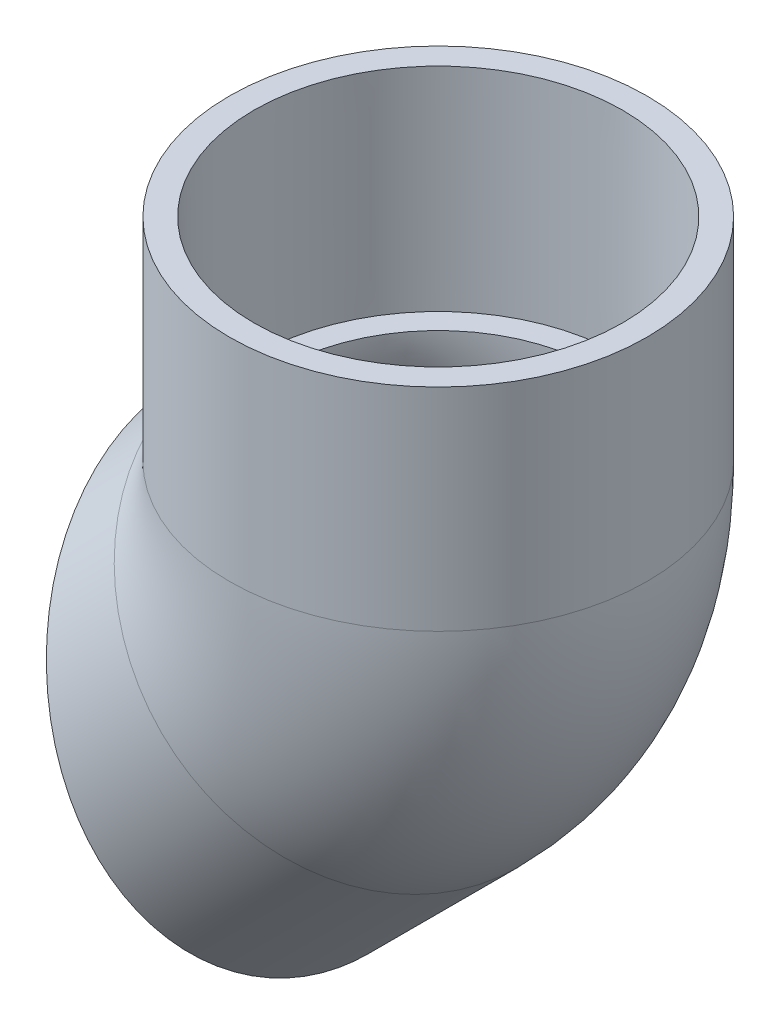
ISO-10303-21;
HEADER;
FILE_DESCRIPTION(('STEP AP214'),'2;1');
FILE_NAME('part.step','',(''),(''),'','','');
FILE_SCHEMA(('AUTOMOTIVE_DESIGN { 1 0 10303 214 1 1 1 1 }'));
ENDSEC;
DATA;
#1=APPLICATION_CONTEXT('core data for automotive mechanical design processes');
#2=APPLICATION_PROTOCOL_DEFINITION('international standard','automotive_design',2000,#1);
#3=PRODUCT_CONTEXT('',#1,'mechanical');
#4=PRODUCT('Part','Part','',(#3));
#5=PRODUCT_RELATED_PRODUCT_CATEGORY('part','',(#4));
#6=PRODUCT_DEFINITION_FORMATION('','',#4);
#7=PRODUCT_DEFINITION_CONTEXT('part definition',#1,'design');
#8=PRODUCT_DEFINITION('design','',#6,#7);
#9=PRODUCT_DEFINITION_SHAPE('','',#8);
#10=(LENGTH_UNIT() NAMED_UNIT(*) SI_UNIT(.MILLI.,.METRE.));
#11=(NAMED_UNIT(*) PLANE_ANGLE_UNIT() SI_UNIT($,.RADIAN.));
#12=(NAMED_UNIT(*) SI_UNIT($,.STERADIAN.) SOLID_ANGLE_UNIT());
#13=UNCERTAINTY_MEASURE_WITH_UNIT(LENGTH_MEASURE(1.E-05),#10,'distance_accuracy_value','');
#14=(GEOMETRIC_REPRESENTATION_CONTEXT(3) GLOBAL_UNCERTAINTY_ASSIGNED_CONTEXT((#13)) GLOBAL_UNIT_ASSIGNED_CONTEXT((#10,
#11,#12)) REPRESENTATION_CONTEXT('',''));
#15=CARTESIAN_POINT('',(0.,0.,0.));
#16=DIRECTION('',(0.,0.,1.));
#17=DIRECTION('',(1.,0.,0.));
#18=AXIS2_PLACEMENT_3D('',#15,#16,#17);
#19=CARTESIAN_POINT('',(-35.831221923066,-35.8312219230659,0.));
#20=DIRECTION('',(-0.707106781186549,-0.707106781186546,0.));
#21=DIRECTION('',(0.707106781186546,-0.707106781186549,0.));
#22=AXIS2_PLACEMENT_3D('',#19,#20,#21);
#23=CYLINDRICAL_SURFACE('',#22,34.3535);
#24=CARTESIAN_POINT('',(-26.8509658019968,-26.8509658019967,0.));
#25=DIRECTION('',(0.908425279154339,0.418047260717447,0.));
#26=DIRECTION('',(0.418047260717447,-0.908425279154339,0.));
#27=AXIS2_PLACEMENT_3D('',#24,#25,#26);
#28=ELLIPSE('',#27,36.6258510105909,34.3535);
#29=CARTESIAN_POINT('',(-11.539629115574,-60.122814730558,0.));
#30=VERTEX_POINT('',#29);
#31=EDGE_CURVE('E12',#30,#30,#28,.F.);
#32=ORIENTED_EDGE('',*,*,#31,.F.);
#33=EDGE_LOOP('',(#32));
#34=FACE_BOUND('',#33,.T.);
#35=CARTESIAN_POINT('',(-11.2253201513365,-11.2253201513364,0.));
#36=DIRECTION('',(-0.707106781186549,-0.707106781186546,0.));
#37=DIRECTION('',(0.707106781186546,-0.707106781186549,0.));
#38=AXIS2_PLACEMENT_3D('',#35,#36,#37);
#39=CIRCLE('',#38,34.3535);
#40=CARTESIAN_POINT('',(13.0662726561555,-35.5169129588286,0.));
#41=VERTEX_POINT('',#40);
#42=EDGE_CURVE('E59',#41,#41,#39,.T.);
#43=ORIENTED_EDGE('',*,*,#42,.T.);
#44=EDGE_LOOP('',(#43));
#45=FACE_BOUND('',#44,.T.);
#46=ADVANCED_FACE('F44',(#34,#45),#23,.T.);
#47=CARTESIAN_POINT('',(-11.2253201513365,-11.2253201513364,0.));
#48=DIRECTION('',(-0.707106781186549,-0.707106781186546,0.));
#49=DIRECTION('',(0.707106781186546,-0.707106781186549,0.));
#50=AXIS2_PLACEMENT_3D('',#47,#48,#49);
#51=CONICAL_SURFACE('',#50,30.0863,0.00656924856536322);
#52=CARTESIAN_POINT('',(-26.8182423880505,-26.9220744522437,0.));
#53=DIRECTION('',(0.908425279154339,0.418047260717447,0.));
#54=DIRECTION('',(0.418047260717447,-0.908425279154339,0.));
#55=AXIS2_PLACEMENT_3D('',#52,#53,#54);
#56=ELLIPSE('',#55,32.231354088452,30.2315584970028);
#57=CARTESIAN_POINT('',(-13.344013102159,-56.2018512875681,0.));
#58=VERTEX_POINT('',#57);
#59=EDGE_CURVE('E79',#58,#58,#56,.T.);
#60=ORIENTED_EDGE('',*,*,#59,.F.);
#61=EDGE_LOOP('',(#60));
#62=FACE_BOUND('',#61,.T.);
#63=CARTESIAN_POINT('',(-11.2253201513365,-11.2253201513364,0.));
#64=DIRECTION('',(-0.707106781186549,-0.707106781186546,0.));
#65=DIRECTION('',(0.707106781186546,-0.707106781186549,0.));
#66=AXIS2_PLACEMENT_3D('',#63,#64,#65);
#67=CIRCLE('',#66,30.0863);
#68=CARTESIAN_POINT('',(10.0489065994763,-32.4995469021493,0.));
#69=VERTEX_POINT('',#68);
#70=EDGE_CURVE('E55',#69,#69,#67,.T.);
#71=ORIENTED_EDGE('',*,*,#70,.F.);
#72=EDGE_LOOP('',(#71));
#73=FACE_BOUND('',#72,.T.);
#74=ADVANCED_FACE('F46',(#62,#73),#51,.F.);
#75=CARTESIAN_POINT('',(-38.3256403026728,15.875,0.));
#76=DIRECTION('',(0.,0.,-1.));
#77=DIRECTION('',(-1.,0.,0.));
#78=AXIS2_PLACEMENT_3D('',#75,#76,#77);
#79=TOROIDAL_SURFACE('',#78,38.3256403026728,26.2509);
#80=CARTESIAN_POINT('',(0.,15.875,0.));
#81=DIRECTION('',(0.,1.,0.));
#82=DIRECTION('',(-1.,0.,0.));
#83=AXIS2_PLACEMENT_3D('',#80,#81,#82);
#84=CIRCLE('',#83,26.2509);
#85=CARTESIAN_POINT('',(26.2509,15.875,0.));
#86=VERTEX_POINT('',#85);
#87=EDGE_CURVE('E67',#86,#86,#84,.T.);
#88=CARTESIAN_POINT('',(-11.2253201513365,-11.2253201513364,0.));
#89=DIRECTION('',(0.707106781186549,0.707106781186546,0.));
#90=DIRECTION('',(-0.707106781186546,0.707106781186549,0.));
#91=AXIS2_PLACEMENT_3D('',#88,#89,#90);
#92=CIRCLE('',#91,26.2509);
#93=CARTESIAN_POINT('',(7.33686925091343,-29.7875095535864,0.));
#94=VERTEX_POINT('',#93);
#95=EDGE_CURVE('E70',#94,#94,#92,.T.);
#96=CARTESIAN_POINT('',(-38.3256403026728,15.875,0.));
#97=DIRECTION('',(0.,0.,-1.));
#98=DIRECTION('',(-1.,0.,0.));
#99=AXIS2_PLACEMENT_3D('',#96,#97,#98);
#100=CIRCLE('',#99,64.5765403026728);
#101=EDGE_CURVE('',#86,#94,#100,.T.);
#102=ORIENTED_EDGE('',*,*,#87,.T.);
#103=ORIENTED_EDGE('',*,*,#95,.F.);
#104=ORIENTED_EDGE('',*,*,#101,.T.);
#105=ORIENTED_EDGE('',*,*,#101,.F.);
#106=EDGE_LOOP('',(#102,#104,#103,#105));
#107=FACE_BOUND('',#106,.T.);
#108=ADVANCED_FACE('F87',(#107),#79,.F.);
#109=CARTESIAN_POINT('',(-38.3256403026728,15.875,0.));
#110=DIRECTION('',(0.,0.,-1.));
#111=DIRECTION('',(-1.,0.,0.));
#112=AXIS2_PLACEMENT_3D('',#109,#110,#111);
#113=TOROIDAL_SURFACE('',#112,38.3256403026728,34.3535);
#114=CARTESIAN_POINT('',(0.,15.875,0.));
#115=DIRECTION('',(0.,1.,0.));
#116=DIRECTION('',(-1.,0.,0.));
#117=AXIS2_PLACEMENT_3D('',#114,#115,#116);
#118=CIRCLE('',#117,34.3535);
#119=CARTESIAN_POINT('',(34.3535,15.875,0.));
#120=VERTEX_POINT('',#119);
#121=EDGE_CURVE('E64',#120,#120,#118,.T.);
#122=CARTESIAN_POINT('',(-38.3256403026728,15.875,0.));
#123=DIRECTION('',(0.,0.,-1.));
#124=DIRECTION('',(-1.,0.,0.));
#125=AXIS2_PLACEMENT_3D('',#122,#123,#124);
#126=CIRCLE('',#125,72.6791403026728);
#127=EDGE_CURVE('',#120,#41,#126,.T.);
#128=ORIENTED_EDGE('',*,*,#121,.F.);
#129=ORIENTED_EDGE('',*,*,#42,.F.);
#130=ORIENTED_EDGE('',*,*,#127,.T.);
#131=ORIENTED_EDGE('',*,*,#127,.F.);
#132=EDGE_LOOP('',(#128,#130,#129,#131));
#133=FACE_BOUND('',#132,.T.);
#134=ADVANCED_FACE('F96',(#133),#113,.T.);
#135=CARTESIAN_POINT('',(0.,15.875,0.));
#136=DIRECTION('',(0.,1.,0.));
#137=DIRECTION('',(-1.,0.,0.));
#138=AXIS2_PLACEMENT_3D('',#135,#136,#137);
#139=PLANE('',#138);
#140=CARTESIAN_POINT('',(0.,15.875,0.));
#141=DIRECTION('',(0.,1.,0.));
#142=DIRECTION('',(-1.,0.,0.));
#143=AXIS2_PLACEMENT_3D('',#140,#141,#142);
#144=CIRCLE('',#143,30.0863);
#145=CARTESIAN_POINT('',(-30.0863,15.875,0.));
#146=VERTEX_POINT('',#145);
#147=EDGE_CURVE('E51',#146,#146,#144,.F.);
#148=ORIENTED_EDGE('',*,*,#147,.F.);
#149=EDGE_LOOP('',(#148));
#150=FACE_BOUND('',#149,.T.);
#151=ORIENTED_EDGE('',*,*,#87,.F.);
#152=EDGE_LOOP('',(#151));
#153=FACE_BOUND('',#152,.T.);
#154=ADVANCED_FACE('F94',(#150,#153),#139,.T.);
#155=CARTESIAN_POINT('',(-11.2253201513365,-11.2253201513364,0.));
#156=DIRECTION('',(0.707106781186549,0.707106781186546,0.));
#157=DIRECTION('',(-0.707106781186546,0.707106781186549,0.));
#158=AXIS2_PLACEMENT_3D('',#155,#156,#157);
#159=PLANE('',#158);
#160=ORIENTED_EDGE('',*,*,#70,.T.);
#161=EDGE_LOOP('',(#160));
#162=FACE_BOUND('',#161,.T.);
#163=ORIENTED_EDGE('',*,*,#95,.T.);
#164=EDGE_LOOP('',(#163));
#165=FACE_BOUND('',#164,.T.);
#166=ADVANCED_FACE('F90',(#162,#165),#159,.F.);
#167=CARTESIAN_POINT('',(34.3535,50.673,0.));
#168=DIRECTION('',(0.,1.,0.));
#169=DIRECTION('',(0.,0.,1.));
#170=AXIS2_PLACEMENT_3D('',#167,#168,#169);
#171=PLANE('',#170);
#172=CARTESIAN_POINT('',(0.,50.673,0.));
#173=DIRECTION('',(0.,-1.,0.));
#174=DIRECTION('',(0.,0.,-1.));
#175=AXIS2_PLACEMENT_3D('',#172,#173,#174);
#176=CIRCLE('',#175,30.3149);
#177=CARTESIAN_POINT('',(0.,50.673,-30.3149));
#178=VERTEX_POINT('',#177);
#179=EDGE_CURVE('E76',#178,#178,#176,.T.);
#180=ORIENTED_EDGE('',*,*,#179,.T.);
#181=EDGE_LOOP('',(#180));
#182=FACE_BOUND('',#181,.T.);
#183=CARTESIAN_POINT('',(0.,50.673,0.));
#184=DIRECTION('',(0.,-1.,0.));
#185=DIRECTION('',(0.,0.,-1.));
#186=AXIS2_PLACEMENT_3D('',#183,#184,#185);
#187=CIRCLE('',#186,34.3535);
#188=CARTESIAN_POINT('',(0.,50.673,-34.3535));
#189=VERTEX_POINT('',#188);
#190=EDGE_CURVE('E73',#189,#189,#187,.T.);
#191=ORIENTED_EDGE('',*,*,#190,.F.);
#192=EDGE_LOOP('',(#191));
#193=FACE_BOUND('',#192,.T.);
#194=ADVANCED_FACE('F93',(#182,#193),#171,.T.);
#195=CARTESIAN_POINT('',(0.,0.,0.));
#196=DIRECTION('',(0.,-1.,0.));
#197=DIRECTION('',(0.,0.,-1.));
#198=AXIS2_PLACEMENT_3D('',#195,#196,#197);
#199=CYLINDRICAL_SURFACE('',#198,34.3535);
#200=ORIENTED_EDGE('',*,*,#190,.T.);
#201=EDGE_LOOP('',(#200));
#202=FACE_BOUND('',#201,.T.);
#203=ORIENTED_EDGE('',*,*,#121,.T.);
#204=EDGE_LOOP('',(#203));
#205=FACE_BOUND('',#204,.T.);
#206=ADVANCED_FACE('F153',(#202,#205),#199,.T.);
#207=CARTESIAN_POINT('',(0.,50.673,0.));
#208=DIRECTION('',(0.,1.,0.));
#209=DIRECTION('',(0.,0.,1.));
#210=AXIS2_PLACEMENT_3D('',#207,#208,#209);
#211=CONICAL_SURFACE('',#210,30.3149,0.00656924856536293);
#212=ORIENTED_EDGE('',*,*,#147,.T.);
#213=EDGE_LOOP('',(#212));
#214=FACE_BOUND('',#213,.T.);
#215=ORIENTED_EDGE('',*,*,#179,.F.);
#216=EDGE_LOOP('',(#215));
#217=FACE_BOUND('',#216,.T.);
#218=ADVANCED_FACE('F163',(#214,#217),#211,.F.);
#219=CARTESIAN_POINT('',(-11.539629115574,-60.122814730558,-34.3535));
#220=DIRECTION('',(0.908425279154339,0.418047260717447,0.));
#221=DIRECTION('',(-0.418047260717447,0.908425279154339,0.));
#222=AXIS2_PLACEMENT_3D('',#219,#220,#221);
#223=PLANE('',#222);
#224=ORIENTED_EDGE('',*,*,#59,.T.);
#225=EDGE_LOOP('',(#224));
#226=FACE_BOUND('',#225,.T.);
#227=ORIENTED_EDGE('',*,*,#31,.T.);
#228=EDGE_LOOP('',(#227));
#229=FACE_BOUND('',#228,.T.);
#230=ADVANCED_FACE('F83',(#226,#229),#223,.F.);
#231=CLOSED_SHELL('',(#46,#74,#108,#134,#154,#166,#194,#206,#218,#230));
#232=MANIFOLD_SOLID_BREP('B2',#231);
#233=ADVANCED_BREP_SHAPE_REPRESENTATION('',(#18,#232),#14);
#234=SHAPE_DEFINITION_REPRESENTATION(#9,#233);
ENDSEC;
END-ISO-10303-21;
